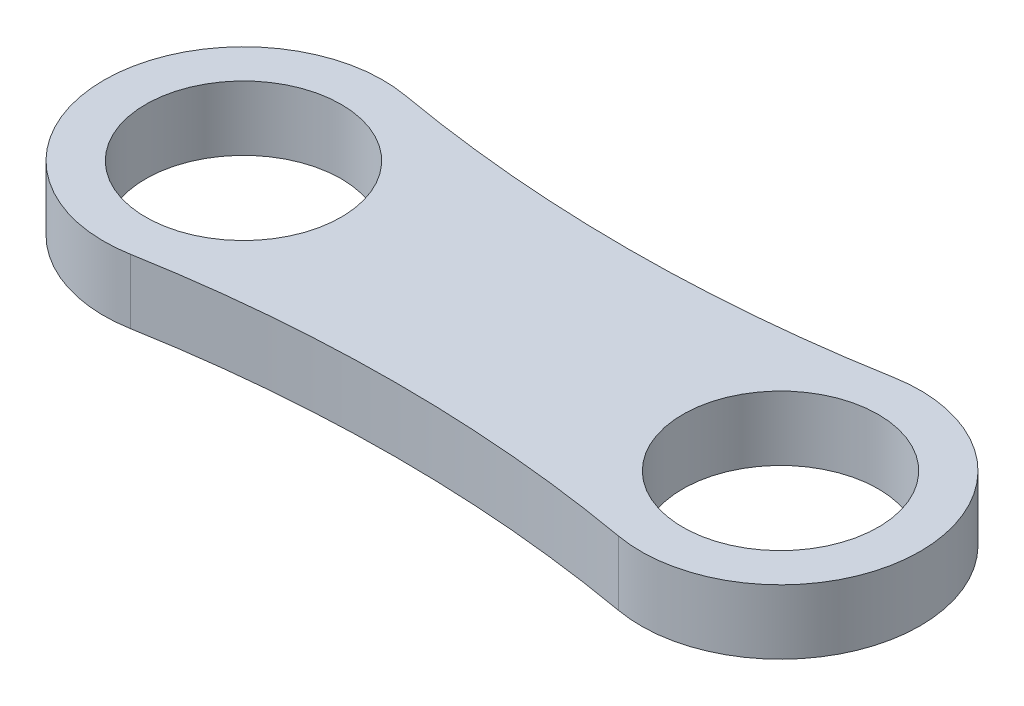
ISO-10303-21;
HEADER;
FILE_DESCRIPTION(('STEP AP214'),'2;1');
FILE_NAME('part.step','',(''),(''),'','','');
FILE_SCHEMA(('AUTOMOTIVE_DESIGN { 1 0 10303 214 1 1 1 1 }'));
ENDSEC;
DATA;
#1=APPLICATION_CONTEXT('core data for automotive mechanical design processes');
#2=APPLICATION_PROTOCOL_DEFINITION('international standard','automotive_design',2000,#1);
#3=PRODUCT_CONTEXT('',#1,'mechanical');
#4=PRODUCT('Part','Part','',(#3));
#5=PRODUCT_RELATED_PRODUCT_CATEGORY('part','',(#4));
#6=PRODUCT_DEFINITION_FORMATION('','',#4);
#7=PRODUCT_DEFINITION_CONTEXT('part definition',#1,'design');
#8=PRODUCT_DEFINITION('design','',#6,#7);
#9=PRODUCT_DEFINITION_SHAPE('','',#8);
#10=(LENGTH_UNIT() NAMED_UNIT(*) SI_UNIT(.MILLI.,.METRE.));
#11=(NAMED_UNIT(*) PLANE_ANGLE_UNIT() SI_UNIT($,.RADIAN.));
#12=(NAMED_UNIT(*) SI_UNIT($,.STERADIAN.) SOLID_ANGLE_UNIT());
#13=UNCERTAINTY_MEASURE_WITH_UNIT(LENGTH_MEASURE(1.E-05),#10,'distance_accuracy_value','');
#14=(GEOMETRIC_REPRESENTATION_CONTEXT(3) GLOBAL_UNCERTAINTY_ASSIGNED_CONTEXT((#13)) GLOBAL_UNIT_ASSIGNED_CONTEXT((#10,
#11,#12)) REPRESENTATION_CONTEXT('',''));
#15=CARTESIAN_POINT('',(0.,0.,0.));
#16=DIRECTION('',(0.,0.,1.));
#17=DIRECTION('',(1.,0.,0.));
#18=AXIS2_PLACEMENT_3D('',#15,#16,#17);
#19=CARTESIAN_POINT('',(-1.5875,0.762,8.9406556806534));
#20=DIRECTION('',(0.,1.,0.));
#21=DIRECTION('',(0.,0.,1.));
#22=AXIS2_PLACEMENT_3D('',#19,#20,#21);
#23=PLANE('',#22);
#24=CARTESIAN_POINT('',(-3.175,0.762,0.));
#25=DIRECTION('',(0.,1.,0.));
#26=DIRECTION('',(0.,0.,1.));
#27=AXIS2_PLACEMENT_3D('',#24,#25,#26);
#28=CIRCLE('',#27,1.1557);
#29=CARTESIAN_POINT('',(-3.175,0.762,-1.1557));
#30=VERTEX_POINT('',#29);
#31=EDGE_CURVE('E113',#30,#30,#28,.T.);
#32=ORIENTED_EDGE('',*,*,#31,.F.);
#33=EDGE_LOOP('',(#32));
#34=FACE_BOUND('',#33,.T.);
#35=CARTESIAN_POINT('',(0.,0.762,17.8813113613068));
#36=DIRECTION('',(0.,-1.,0.));
#37=DIRECTION('',(0.,0.,1.));
#38=AXIS2_PLACEMENT_3D('',#35,#36,#37);
#39=CIRCLE('',#38,16.51);
#40=CARTESIAN_POINT('',(-2.88636363636364,0.762,1.6255737601188));
#41=VERTEX_POINT('',#40);
#42=CARTESIAN_POINT('',(2.88636363636364,0.762,1.6255737601188));
#43=VERTEX_POINT('',#42);
#44=EDGE_CURVE('E93',#41,#43,#39,.T.);
#45=ORIENTED_EDGE('',*,*,#44,.T.);
#46=CARTESIAN_POINT('',(3.175,0.762,0.));
#47=DIRECTION('',(0.,1.,0.));
#48=DIRECTION('',(0.,0.,1.));
#49=AXIS2_PLACEMENT_3D('',#46,#47,#48);
#50=CIRCLE('',#49,1.651);
#51=CARTESIAN_POINT('',(2.88636363636364,0.762,-1.6255737601188));
#52=VERTEX_POINT('',#51);
#53=EDGE_CURVE('E88',#43,#52,#50,.T.);
#54=ORIENTED_EDGE('',*,*,#53,.T.);
#55=CARTESIAN_POINT('',(0.,0.762,-17.8813113613068));
#56=DIRECTION('',(0.,-1.,0.));
#57=DIRECTION('',(0.,0.,1.));
#58=AXIS2_PLACEMENT_3D('',#55,#56,#57);
#59=CIRCLE('',#58,16.51);
#60=CARTESIAN_POINT('',(-2.88636363636364,0.762,-1.6255737601188));
#61=VERTEX_POINT('',#60);
#62=EDGE_CURVE('E91',#52,#61,#59,.T.);
#63=ORIENTED_EDGE('',*,*,#62,.T.);
#64=CARTESIAN_POINT('',(-3.175,0.762,0.));
#65=DIRECTION('',(0.,1.,0.));
#66=DIRECTION('',(0.,0.,1.));
#67=AXIS2_PLACEMENT_3D('',#64,#65,#66);
#68=CIRCLE('',#67,1.651);
#69=EDGE_CURVE('E58',#61,#41,#68,.T.);
#70=ORIENTED_EDGE('',*,*,#69,.T.);
#71=EDGE_LOOP('',(#45,#54,#63,#70));
#72=FACE_BOUND('',#71,.T.);
#73=CARTESIAN_POINT('',(3.175,0.762,0.));
#74=DIRECTION('',(0.,1.,0.));
#75=DIRECTION('',(0.,0.,1.));
#76=AXIS2_PLACEMENT_3D('',#73,#74,#75);
#77=CIRCLE('',#76,1.1557);
#78=CARTESIAN_POINT('',(3.175,0.762,-1.1557));
#79=VERTEX_POINT('',#78);
#80=EDGE_CURVE('E135',#79,#79,#77,.T.);
#81=ORIENTED_EDGE('',*,*,#80,.F.);
#82=EDGE_LOOP('',(#81));
#83=FACE_BOUND('',#82,.T.);
#84=ADVANCED_FACE('F40',(#34,#72,#83),#23,.T.);
#85=CARTESIAN_POINT('',(-1.5875,0.,8.9406556806534));
#86=DIRECTION('',(0.,1.,0.));
#87=DIRECTION('',(0.,0.,1.));
#88=AXIS2_PLACEMENT_3D('',#85,#86,#87);
#89=PLANE('',#88);
#90=CARTESIAN_POINT('',(0.,0.,17.8813113613068));
#91=DIRECTION('',(0.,-1.,0.));
#92=DIRECTION('',(0.,0.,1.));
#93=AXIS2_PLACEMENT_3D('',#90,#91,#92);
#94=CIRCLE('',#93,16.51);
#95=CARTESIAN_POINT('',(-2.88636363636364,0.,1.6255737601188));
#96=VERTEX_POINT('',#95);
#97=CARTESIAN_POINT('',(2.88636363636364,0.,1.6255737601188));
#98=VERTEX_POINT('',#97);
#99=EDGE_CURVE('E109',#96,#98,#94,.T.);
#100=ORIENTED_EDGE('',*,*,#99,.F.);
#101=CARTESIAN_POINT('',(-3.175,0.,0.));
#102=DIRECTION('',(0.,1.,0.));
#103=DIRECTION('',(0.,0.,1.));
#104=AXIS2_PLACEMENT_3D('',#101,#102,#103);
#105=CIRCLE('',#104,1.651);
#106=CARTESIAN_POINT('',(-2.88636363636364,0.,-1.6255737601188));
#107=VERTEX_POINT('',#106);
#108=EDGE_CURVE('E81',#107,#96,#105,.T.);
#109=ORIENTED_EDGE('',*,*,#108,.F.);
#110=CARTESIAN_POINT('',(0.,0.,-17.8813113613068));
#111=DIRECTION('',(0.,-1.,0.));
#112=DIRECTION('',(0.,0.,1.));
#113=AXIS2_PLACEMENT_3D('',#110,#111,#112);
#114=CIRCLE('',#113,16.51);
#115=CARTESIAN_POINT('',(2.88636363636364,0.,-1.6255737601188));
#116=VERTEX_POINT('',#115);
#117=EDGE_CURVE('E75',#116,#107,#114,.T.);
#118=ORIENTED_EDGE('',*,*,#117,.F.);
#119=CARTESIAN_POINT('',(3.175,0.,0.));
#120=DIRECTION('',(0.,1.,0.));
#121=DIRECTION('',(0.,0.,1.));
#122=AXIS2_PLACEMENT_3D('',#119,#120,#121);
#123=CIRCLE('',#122,1.651);
#124=EDGE_CURVE('E98',#98,#116,#123,.T.);
#125=ORIENTED_EDGE('',*,*,#124,.F.);
#126=EDGE_LOOP('',(#100,#109,#118,#125));
#127=FACE_BOUND('',#126,.T.);
#128=CARTESIAN_POINT('',(-3.175,0.,0.));
#129=DIRECTION('',(0.,1.,0.));
#130=DIRECTION('',(0.,0.,1.));
#131=AXIS2_PLACEMENT_3D('',#128,#129,#130);
#132=CIRCLE('',#131,1.1557);
#133=CARTESIAN_POINT('',(-3.175,0.,-1.1557));
#134=VERTEX_POINT('',#133);
#135=EDGE_CURVE('E131',#134,#134,#132,.T.);
#136=ORIENTED_EDGE('',*,*,#135,.T.);
#137=EDGE_LOOP('',(#136));
#138=FACE_BOUND('',#137,.T.);
#139=CARTESIAN_POINT('',(3.175,0.,0.));
#140=DIRECTION('',(0.,1.,0.));
#141=DIRECTION('',(0.,0.,1.));
#142=AXIS2_PLACEMENT_3D('',#139,#140,#141);
#143=CIRCLE('',#142,1.1557);
#144=CARTESIAN_POINT('',(3.175,0.,-1.1557));
#145=VERTEX_POINT('',#144);
#146=EDGE_CURVE('E139',#145,#145,#143,.T.);
#147=ORIENTED_EDGE('',*,*,#146,.T.);
#148=EDGE_LOOP('',(#147));
#149=FACE_BOUND('',#148,.T.);
#150=ADVANCED_FACE('F126',(#127,#138,#149),#89,.F.);
#151=CARTESIAN_POINT('',(0.,0.762,17.8813113613068));
#152=DIRECTION('',(0.,-1.,0.));
#153=DIRECTION('',(0.,0.,-1.));
#154=AXIS2_PLACEMENT_3D('',#151,#152,#153);
#155=CYLINDRICAL_SURFACE('',#154,16.51);
#156=ORIENTED_EDGE('',*,*,#99,.T.);
#157=DIRECTION('',(0.,-1.,0.));
#158=VECTOR('',#157,1.);
#159=CARTESIAN_POINT('',(2.88636363636364,0.762,1.6255737601188));
#160=LINE('',#159,#158);
#161=EDGE_CURVE('E11',#43,#98,#160,.T.);
#162=ORIENTED_EDGE('',*,*,#161,.F.);
#163=ORIENTED_EDGE('',*,*,#44,.F.);
#164=DIRECTION('',(0.,-1.,0.));
#165=VECTOR('',#164,1.);
#166=CARTESIAN_POINT('',(-2.88636363636364,0.762,1.6255737601188));
#167=LINE('',#166,#165);
#168=EDGE_CURVE('E105',#41,#96,#167,.T.);
#169=ORIENTED_EDGE('',*,*,#168,.T.);
#170=EDGE_LOOP('',(#156,#162,#163,#169));
#171=FACE_BOUND('',#170,.T.);
#172=ADVANCED_FACE('F42',(#171),#155,.F.);
#173=CARTESIAN_POINT('',(3.175,0.762,0.));
#174=DIRECTION('',(0.,-1.,0.));
#175=DIRECTION('',(0.,0.,-1.));
#176=AXIS2_PLACEMENT_3D('',#173,#174,#175);
#177=CYLINDRICAL_SURFACE('',#176,1.651);
#178=ORIENTED_EDGE('',*,*,#124,.T.);
#179=DIRECTION('',(0.,-1.,0.));
#180=VECTOR('',#179,1.);
#181=CARTESIAN_POINT('',(2.88636363636364,0.762,-1.6255737601188));
#182=LINE('',#181,#180);
#183=EDGE_CURVE('E50',#52,#116,#182,.T.);
#184=ORIENTED_EDGE('',*,*,#183,.F.);
#185=ORIENTED_EDGE('',*,*,#53,.F.);
#186=ORIENTED_EDGE('',*,*,#161,.T.);
#187=EDGE_LOOP('',(#178,#184,#185,#186));
#188=FACE_BOUND('',#187,.T.);
#189=ADVANCED_FACE('F97',(#188),#177,.T.);
#190=CARTESIAN_POINT('',(0.,0.762,-17.8813113613068));
#191=DIRECTION('',(0.,-1.,0.));
#192=DIRECTION('',(0.,0.,-1.));
#193=AXIS2_PLACEMENT_3D('',#190,#191,#192);
#194=CYLINDRICAL_SURFACE('',#193,16.51);
#195=ORIENTED_EDGE('',*,*,#117,.T.);
#196=DIRECTION('',(0.,-1.,0.));
#197=VECTOR('',#196,1.);
#198=CARTESIAN_POINT('',(-2.88636363636364,0.762,-1.6255737601188));
#199=LINE('',#198,#197);
#200=EDGE_CURVE('E100',#61,#107,#199,.T.);
#201=ORIENTED_EDGE('',*,*,#200,.F.);
#202=ORIENTED_EDGE('',*,*,#62,.F.);
#203=ORIENTED_EDGE('',*,*,#183,.T.);
#204=EDGE_LOOP('',(#195,#201,#202,#203));
#205=FACE_BOUND('',#204,.T.);
#206=ADVANCED_FACE('F101',(#205),#194,.F.);
#207=CARTESIAN_POINT('',(-3.175,0.762,0.));
#208=DIRECTION('',(0.,-1.,0.));
#209=DIRECTION('',(0.,0.,-1.));
#210=AXIS2_PLACEMENT_3D('',#207,#208,#209);
#211=CYLINDRICAL_SURFACE('',#210,1.651);
#212=ORIENTED_EDGE('',*,*,#108,.T.);
#213=ORIENTED_EDGE('',*,*,#168,.F.);
#214=ORIENTED_EDGE('',*,*,#69,.F.);
#215=ORIENTED_EDGE('',*,*,#200,.T.);
#216=EDGE_LOOP('',(#212,#213,#214,#215));
#217=FACE_BOUND('',#216,.T.);
#218=ADVANCED_FACE('F123',(#217),#211,.T.);
#219=CARTESIAN_POINT('',(-3.175,0.762,0.));
#220=DIRECTION('',(0.,-1.,0.));
#221=DIRECTION('',(0.,0.,-1.));
#222=AXIS2_PLACEMENT_3D('',#219,#220,#221);
#223=CYLINDRICAL_SURFACE('',#222,1.1557);
#224=CARTESIAN_POINT('',(-3.175,0.762,-1.1557));
#225=CARTESIAN_POINT('',(-3.175,0.7540625,-1.1557));
#226=CARTESIAN_POINT('',(-3.175,0.746125,-1.1557));
#227=CARTESIAN_POINT('',(-3.175,0.73025,-1.1557));
#228=CARTESIAN_POINT('',(-3.175,0.7223125,-1.1557));
#229=CARTESIAN_POINT('',(-3.175,0.7064375,-1.1557));
#230=CARTESIAN_POINT('',(-3.175,0.6985,-1.1557));
#231=CARTESIAN_POINT('',(-3.175,0.682625,-1.1557));
#232=CARTESIAN_POINT('',(-3.175,0.6746875,-1.1557));
#233=CARTESIAN_POINT('',(-3.175,0.6588125,-1.1557));
#234=CARTESIAN_POINT('',(-3.175,0.650875,-1.1557));
#235=CARTESIAN_POINT('',(-3.175,0.635,-1.1557));
#236=CARTESIAN_POINT('',(-3.175,0.6270625,-1.1557));
#237=CARTESIAN_POINT('',(-3.175,0.6111875,-1.1557));
#238=CARTESIAN_POINT('',(-3.175,0.60325,-1.1557));
#239=CARTESIAN_POINT('',(-3.175,0.587375,-1.1557));
#240=CARTESIAN_POINT('',(-3.175,0.5794375,-1.1557));
#241=CARTESIAN_POINT('',(-3.175,0.5635625,-1.1557));
#242=CARTESIAN_POINT('',(-3.175,0.555625,-1.1557));
#243=CARTESIAN_POINT('',(-3.175,0.53975,-1.1557));
#244=CARTESIAN_POINT('',(-3.175,0.5318125,-1.1557));
#245=CARTESIAN_POINT('',(-3.175,0.5159375,-1.1557));
#246=CARTESIAN_POINT('',(-3.175,0.508,-1.1557));
#247=CARTESIAN_POINT('',(-3.175,0.492125,-1.1557));
#248=CARTESIAN_POINT('',(-3.175,0.4841875,-1.1557));
#249=CARTESIAN_POINT('',(-3.175,0.4683125,-1.1557));
#250=CARTESIAN_POINT('',(-3.175,0.460375,-1.1557));
#251=CARTESIAN_POINT('',(-3.175,0.4445,-1.1557));
#252=CARTESIAN_POINT('',(-3.175,0.4365625,-1.1557));
#253=CARTESIAN_POINT('',(-3.175,0.4206875,-1.1557));
#254=CARTESIAN_POINT('',(-3.175,0.41275,-1.1557));
#255=CARTESIAN_POINT('',(-3.175,0.396875,-1.1557));
#256=CARTESIAN_POINT('',(-3.175,0.3889375,-1.1557));
#257=CARTESIAN_POINT('',(-3.175,0.3730625,-1.1557));
#258=CARTESIAN_POINT('',(-3.175,0.365125,-1.1557));
#259=CARTESIAN_POINT('',(-3.175,0.34925,-1.1557));
#260=CARTESIAN_POINT('',(-3.175,0.3413125,-1.1557));
#261=CARTESIAN_POINT('',(-3.175,0.3254375,-1.1557));
#262=CARTESIAN_POINT('',(-3.175,0.3175,-1.1557));
#263=CARTESIAN_POINT('',(-3.175,0.301625,-1.1557));
#264=CARTESIAN_POINT('',(-3.175,0.2936875,-1.1557));
#265=CARTESIAN_POINT('',(-3.175,0.2778125,-1.1557));
#266=CARTESIAN_POINT('',(-3.175,0.269875,-1.1557));
#267=CARTESIAN_POINT('',(-3.175,0.254,-1.1557));
#268=CARTESIAN_POINT('',(-3.175,0.2460625,-1.1557));
#269=CARTESIAN_POINT('',(-3.175,0.2301875,-1.1557));
#270=CARTESIAN_POINT('',(-3.175,0.22225,-1.1557));
#271=CARTESIAN_POINT('',(-3.175,0.206375,-1.1557));
#272=CARTESIAN_POINT('',(-3.175,0.1984375,-1.1557));
#273=CARTESIAN_POINT('',(-3.175,0.1825625,-1.1557));
#274=CARTESIAN_POINT('',(-3.175,0.174625,-1.1557));
#275=CARTESIAN_POINT('',(-3.175,0.15875,-1.1557));
#276=CARTESIAN_POINT('',(-3.175,0.1508125,-1.1557));
#277=CARTESIAN_POINT('',(-3.175,0.1349375,-1.1557));
#278=CARTESIAN_POINT('',(-3.175,0.127,-1.1557));
#279=CARTESIAN_POINT('',(-3.175,0.111125,-1.1557));
#280=CARTESIAN_POINT('',(-3.175,0.1031875,-1.1557));
#281=CARTESIAN_POINT('',(-3.175,0.0873125,-1.1557));
#282=CARTESIAN_POINT('',(-3.175,0.079375,-1.1557));
#283=CARTESIAN_POINT('',(-3.175,0.0635,-1.1557));
#284=CARTESIAN_POINT('',(-3.175,0.0555625,-1.1557));
#285=CARTESIAN_POINT('',(-3.175,0.0396875,-1.1557));
#286=CARTESIAN_POINT('',(-3.175,0.03175,-1.1557));
#287=CARTESIAN_POINT('',(-3.175,0.015875,-1.1557));
#288=CARTESIAN_POINT('',(-3.175,0.00793749999999999,-1.1557));
#289=CARTESIAN_POINT('',(-3.175,0.,-1.1557));
#290=B_SPLINE_CURVE_WITH_KNOTS('',3,(#224,#225,#226,#227,#228,#229,#230,#231,#232,#233,#234,
#235,#236,#237,#238,#239,#240,#241,#242,#243,#244,#245,#246,#247,#248,#249,#250,#251,#252,#253,
#254,#255,#256,#257,#258,#259,#260,#261,#262,#263,#264,#265,#266,#267,#268,#269,#270,#271,#272,
#273,#274,#275,#276,#277,#278,#279,#280,#281,#282,#283,#284,#285,#286,#287,#288,#289),
.UNSPECIFIED.,.F.,.F.,(4,2,2,2,2,2,2,2,2,2,2,2,2,2,2,2,2,2,2,2,2,2,2,2,2,2,2,2,2,2,2,2,4),(0.,
0.0238125,0.0476249999999999,0.0714374999999999,0.09525,0.1190625,0.142875,0.1666875,0.1905,
0.2143125,0.238125,0.2619375,0.28575,0.3095625,0.333375,0.3571875,0.381,0.4048125,0.428625,
0.4524375,0.47625,0.5000625,0.523875,0.5476875,0.5715,0.5953125,0.619125,0.6429375,0.66675,
0.6905625,0.714375,0.7381875,0.762),.UNSPECIFIED.);
#291=EDGE_CURVE('BSEAM158',#30,#134,#290,.T.);
#292=ORIENTED_EDGE('',*,*,#31,.T.);
#293=ORIENTED_EDGE('',*,*,#135,.F.);
#294=ORIENTED_EDGE('',*,*,#291,.T.);
#295=ORIENTED_EDGE('',*,*,#291,.F.);
#296=EDGE_LOOP('',(#292,#294,#293,#295));
#297=FACE_BOUND('',#296,.T.);
#298=ADVANCED_FACE('F158',(#297),#223,.F.);
#299=CARTESIAN_POINT('',(3.175,0.762,0.));
#300=DIRECTION('',(0.,-1.,0.));
#301=DIRECTION('',(0.,0.,-1.));
#302=AXIS2_PLACEMENT_3D('',#299,#300,#301);
#303=CYLINDRICAL_SURFACE('',#302,1.1557);
#304=CARTESIAN_POINT('',(3.175,0.762,-1.1557));
#305=CARTESIAN_POINT('',(3.175,0.7540625,-1.1557));
#306=CARTESIAN_POINT('',(3.175,0.746125,-1.1557));
#307=CARTESIAN_POINT('',(3.175,0.73025,-1.1557));
#308=CARTESIAN_POINT('',(3.175,0.7223125,-1.1557));
#309=CARTESIAN_POINT('',(3.175,0.7064375,-1.1557));
#310=CARTESIAN_POINT('',(3.175,0.6985,-1.1557));
#311=CARTESIAN_POINT('',(3.175,0.682625,-1.1557));
#312=CARTESIAN_POINT('',(3.175,0.6746875,-1.1557));
#313=CARTESIAN_POINT('',(3.175,0.6588125,-1.1557));
#314=CARTESIAN_POINT('',(3.175,0.650875,-1.1557));
#315=CARTESIAN_POINT('',(3.175,0.635,-1.1557));
#316=CARTESIAN_POINT('',(3.175,0.6270625,-1.1557));
#317=CARTESIAN_POINT('',(3.175,0.6111875,-1.1557));
#318=CARTESIAN_POINT('',(3.175,0.60325,-1.1557));
#319=CARTESIAN_POINT('',(3.175,0.587375,-1.1557));
#320=CARTESIAN_POINT('',(3.175,0.5794375,-1.1557));
#321=CARTESIAN_POINT('',(3.175,0.5635625,-1.1557));
#322=CARTESIAN_POINT('',(3.175,0.555625,-1.1557));
#323=CARTESIAN_POINT('',(3.175,0.53975,-1.1557));
#324=CARTESIAN_POINT('',(3.175,0.5318125,-1.1557));
#325=CARTESIAN_POINT('',(3.175,0.5159375,-1.1557));
#326=CARTESIAN_POINT('',(3.175,0.508,-1.1557));
#327=CARTESIAN_POINT('',(3.175,0.492125,-1.1557));
#328=CARTESIAN_POINT('',(3.175,0.4841875,-1.1557));
#329=CARTESIAN_POINT('',(3.175,0.4683125,-1.1557));
#330=CARTESIAN_POINT('',(3.175,0.460375,-1.1557));
#331=CARTESIAN_POINT('',(3.175,0.4445,-1.1557));
#332=CARTESIAN_POINT('',(3.175,0.4365625,-1.1557));
#333=CARTESIAN_POINT('',(3.175,0.4206875,-1.1557));
#334=CARTESIAN_POINT('',(3.175,0.41275,-1.1557));
#335=CARTESIAN_POINT('',(3.175,0.396875,-1.1557));
#336=CARTESIAN_POINT('',(3.175,0.3889375,-1.1557));
#337=CARTESIAN_POINT('',(3.175,0.3730625,-1.1557));
#338=CARTESIAN_POINT('',(3.175,0.365125,-1.1557));
#339=CARTESIAN_POINT('',(3.175,0.34925,-1.1557));
#340=CARTESIAN_POINT('',(3.175,0.3413125,-1.1557));
#341=CARTESIAN_POINT('',(3.175,0.3254375,-1.1557));
#342=CARTESIAN_POINT('',(3.175,0.3175,-1.1557));
#343=CARTESIAN_POINT('',(3.175,0.301625,-1.1557));
#344=CARTESIAN_POINT('',(3.175,0.2936875,-1.1557));
#345=CARTESIAN_POINT('',(3.175,0.2778125,-1.1557));
#346=CARTESIAN_POINT('',(3.175,0.269875,-1.1557));
#347=CARTESIAN_POINT('',(3.175,0.254,-1.1557));
#348=CARTESIAN_POINT('',(3.175,0.2460625,-1.1557));
#349=CARTESIAN_POINT('',(3.175,0.2301875,-1.1557));
#350=CARTESIAN_POINT('',(3.175,0.22225,-1.1557));
#351=CARTESIAN_POINT('',(3.175,0.206375,-1.1557));
#352=CARTESIAN_POINT('',(3.175,0.1984375,-1.1557));
#353=CARTESIAN_POINT('',(3.175,0.1825625,-1.1557));
#354=CARTESIAN_POINT('',(3.175,0.174625,-1.1557));
#355=CARTESIAN_POINT('',(3.175,0.15875,-1.1557));
#356=CARTESIAN_POINT('',(3.175,0.1508125,-1.1557));
#357=CARTESIAN_POINT('',(3.175,0.1349375,-1.1557));
#358=CARTESIAN_POINT('',(3.175,0.127,-1.1557));
#359=CARTESIAN_POINT('',(3.175,0.111125,-1.1557));
#360=CARTESIAN_POINT('',(3.175,0.1031875,-1.1557));
#361=CARTESIAN_POINT('',(3.175,0.0873125,-1.1557));
#362=CARTESIAN_POINT('',(3.175,0.079375,-1.1557));
#363=CARTESIAN_POINT('',(3.175,0.0635,-1.1557));
#364=CARTESIAN_POINT('',(3.175,0.0555625,-1.1557));
#365=CARTESIAN_POINT('',(3.175,0.0396875,-1.1557));
#366=CARTESIAN_POINT('',(3.175,0.03175,-1.1557));
#367=CARTESIAN_POINT('',(3.175,0.015875,-1.1557));
#368=CARTESIAN_POINT('',(3.175,0.00793749999999999,-1.1557));
#369=CARTESIAN_POINT('',(3.175,0.,-1.1557));
#370=B_SPLINE_CURVE_WITH_KNOTS('',3,(#304,#305,#306,#307,#308,#309,#310,#311,#312,#313,#314,
#315,#316,#317,#318,#319,#320,#321,#322,#323,#324,#325,#326,#327,#328,#329,#330,#331,#332,#333,
#334,#335,#336,#337,#338,#339,#340,#341,#342,#343,#344,#345,#346,#347,#348,#349,#350,#351,#352,
#353,#354,#355,#356,#357,#358,#359,#360,#361,#362,#363,#364,#365,#366,#367,#368,#369),
.UNSPECIFIED.,.F.,.F.,(4,2,2,2,2,2,2,2,2,2,2,2,2,2,2,2,2,2,2,2,2,2,2,2,2,2,2,2,2,2,2,2,4),(0.,
0.0238125,0.0476249999999999,0.0714374999999999,0.09525,0.1190625,0.142875,0.1666875,0.1905,
0.2143125,0.238125,0.2619375,0.28575,0.3095625,0.333375,0.3571875,0.381,0.4048125,0.428625,
0.4524375,0.47625,0.5000625,0.523875,0.5476875,0.5715,0.5953125,0.619125,0.6429375,0.66675,
0.6905625,0.714375,0.7381875,0.762),.UNSPECIFIED.);
#371=EDGE_CURVE('BSEAM147',#79,#145,#370,.T.);
#372=ORIENTED_EDGE('',*,*,#80,.T.);
#373=ORIENTED_EDGE('',*,*,#146,.F.);
#374=ORIENTED_EDGE('',*,*,#371,.T.);
#375=ORIENTED_EDGE('',*,*,#371,.F.);
#376=EDGE_LOOP('',(#372,#374,#373,#375));
#377=FACE_BOUND('',#376,.T.);
#378=ADVANCED_FACE('F147',(#377),#303,.F.);
#379=CLOSED_SHELL('',(#84,#150,#172,#189,#206,#218,#298,#378));
#380=MANIFOLD_SOLID_BREP('B2',#379);
#381=ADVANCED_BREP_SHAPE_REPRESENTATION('',(#18,#380),#14);
#382=SHAPE_DEFINITION_REPRESENTATION(#9,#381);
ENDSEC;
END-ISO-10303-21;
